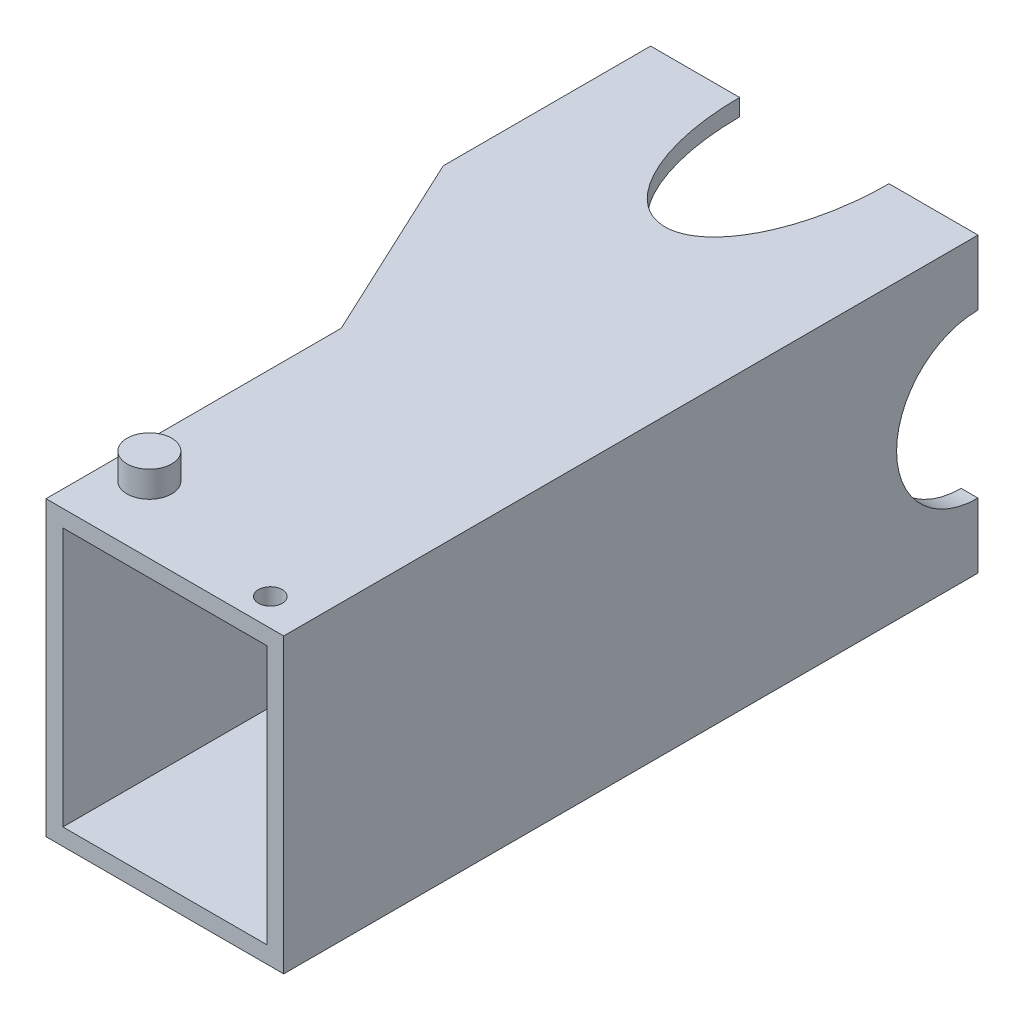
ISO-10303-21;
HEADER;
FILE_DESCRIPTION(('STEP AP214'),'2;1');
FILE_NAME('part.step','',(''),(''),'','','');
FILE_SCHEMA(('AUTOMOTIVE_DESIGN { 1 0 10303 214 1 1 1 1 }'));
ENDSEC;
DATA;
#1=APPLICATION_CONTEXT('core data for automotive mechanical design processes');
#2=APPLICATION_PROTOCOL_DEFINITION('international standard','automotive_design',2000,#1);
#3=PRODUCT_CONTEXT('',#1,'mechanical');
#4=PRODUCT('Part','Part','',(#3));
#5=PRODUCT_RELATED_PRODUCT_CATEGORY('part','',(#4));
#6=PRODUCT_DEFINITION_FORMATION('','',#4);
#7=PRODUCT_DEFINITION_CONTEXT('part definition',#1,'design');
#8=PRODUCT_DEFINITION('design','',#6,#7);
#9=PRODUCT_DEFINITION_SHAPE('','',#8);
#10=(LENGTH_UNIT() NAMED_UNIT(*) SI_UNIT(.MILLI.,.METRE.));
#11=(NAMED_UNIT(*) PLANE_ANGLE_UNIT() SI_UNIT($,.RADIAN.));
#12=(NAMED_UNIT(*) SI_UNIT($,.STERADIAN.) SOLID_ANGLE_UNIT());
#13=UNCERTAINTY_MEASURE_WITH_UNIT(LENGTH_MEASURE(1.E-05),#10,'distance_accuracy_value','');
#14=(GEOMETRIC_REPRESENTATION_CONTEXT(3) GLOBAL_UNCERTAINTY_ASSIGNED_CONTEXT((#13)) GLOBAL_UNIT_ASSIGNED_CONTEXT((#10,
#11,#12)) REPRESENTATION_CONTEXT('',''));
#15=CARTESIAN_POINT('',(0.,0.,0.));
#16=DIRECTION('',(0.,0.,1.));
#17=DIRECTION('',(1.,0.,0.));
#18=AXIS2_PLACEMENT_3D('',#15,#16,#17);
#19=CARTESIAN_POINT('',(0.,0.,0.));
#20=DIRECTION('',(0.,0.,-1.));
#21=DIRECTION('',(-1.,0.,0.));
#22=AXIS2_PLACEMENT_3D('',#19,#20,#21);
#23=PLANE('',#22);
#24=DIRECTION('',(1.,0.,0.));
#25=VECTOR('',#24,1.);
#26=CARTESIAN_POINT('',(-100.,-8.73500000000001,0.));
#27=LINE('',#26,#25);
#28=CARTESIAN_POINT('',(-44.03,-8.735,0.));
#29=VERTEX_POINT('',#28);
#30=CARTESIAN_POINT('',(-41.76,-8.735,0.));
#31=VERTEX_POINT('',#30);
#32=EDGE_CURVE('E48',#29,#31,#27,.T.);
#33=ORIENTED_EDGE('',*,*,#32,.F.);
#34=DIRECTION('',(0.,-1.,0.));
#35=VECTOR('',#34,1.);
#36=CARTESIAN_POINT('',(-44.03,0.,0.));
#37=LINE('',#36,#35);
#38=CARTESIAN_POINT('',(-44.03,0.,0.));
#39=VERTEX_POINT('',#38);
#40=EDGE_CURVE('E234',#39,#29,#37,.T.);
#41=ORIENTED_EDGE('',*,*,#40,.F.);
#42=DIRECTION('',(-1.,0.,0.));
#43=VECTOR('',#42,1.);
#44=CARTESIAN_POINT('',(0.,0.,0.));
#45=LINE('',#44,#43);
#46=CARTESIAN_POINT('',(-32.065,0.,0.));
#47=VERTEX_POINT('',#46);
#48=EDGE_CURVE('E224',#47,#39,#45,.T.);
#49=ORIENTED_EDGE('',*,*,#48,.F.);
#50=DIRECTION('',(0.,1.,0.));
#51=VECTOR('',#50,1.);
#52=CARTESIAN_POINT('',(-32.065,-100.,0.));
#53=LINE('',#52,#51);
#54=CARTESIAN_POINT('',(-32.065,-2.27,0.));
#55=VERTEX_POINT('',#54);
#56=EDGE_CURVE('E473',#55,#47,#53,.T.);
#57=ORIENTED_EDGE('',*,*,#56,.F.);
#58=DIRECTION('',(1.,0.,0.));
#59=VECTOR('',#58,1.);
#60=CARTESIAN_POINT('',(-41.76,-2.27,0.));
#61=LINE('',#60,#59);
#62=CARTESIAN_POINT('',(-41.76,-2.27,0.));
#63=VERTEX_POINT('',#62);
#64=EDGE_CURVE('E284',#63,#55,#61,.T.);
#65=ORIENTED_EDGE('',*,*,#64,.F.);
#66=DIRECTION('',(0.,1.,0.));
#67=VECTOR('',#66,1.);
#68=CARTESIAN_POINT('',(-41.76,-37.1,0.));
#69=LINE('',#68,#67);
#70=EDGE_CURVE('E293',#31,#63,#69,.T.);
#71=ORIENTED_EDGE('',*,*,#70,.F.);
#72=EDGE_LOOP('',(#33,#41,#49,#57,#65,#71));
#73=FACE_BOUND('',#72,.T.);
#74=ADVANCED_FACE('F33',(#73),#23,.T.);
#75=DIRECTION('',(1.,0.,0.));
#76=VECTOR('',#75,1.);
#77=CARTESIAN_POINT('',(-100.,-8.73500000000001,0.));
#78=LINE('',#77,#76);
#79=CARTESIAN_POINT('',(-2.26999999999999,-8.735,0.));
#80=VERTEX_POINT('',#79);
#81=CARTESIAN_POINT('',(0.,-8.735,0.));
#82=VERTEX_POINT('',#81);
#83=EDGE_CURVE('E197',#80,#82,#78,.T.);
#84=ORIENTED_EDGE('',*,*,#83,.F.);
#85=DIRECTION('',(0.,-1.,0.));
#86=VECTOR('',#85,1.);
#87=CARTESIAN_POINT('',(-2.26999999999999,-37.1,0.));
#88=LINE('',#87,#86);
#89=CARTESIAN_POINT('',(-2.26999999999999,-2.27,0.));
#90=VERTEX_POINT('',#89);
#91=EDGE_CURVE('E288',#90,#80,#88,.T.);
#92=ORIENTED_EDGE('',*,*,#91,.F.);
#93=CARTESIAN_POINT('',(-11.965,-2.27,0.));
#94=VERTEX_POINT('',#93);
#95=EDGE_CURVE('E280',#94,#90,#61,.T.);
#96=ORIENTED_EDGE('',*,*,#95,.F.);
#97=DIRECTION('',(0.,1.,0.));
#98=VECTOR('',#97,1.);
#99=CARTESIAN_POINT('',(-11.965,-100.,0.));
#100=LINE('',#99,#98);
#101=CARTESIAN_POINT('',(-11.965,0.,0.));
#102=VERTEX_POINT('',#101);
#103=EDGE_CURVE('E287',#102,#94,#100,.F.);
#104=ORIENTED_EDGE('',*,*,#103,.F.);
#105=CARTESIAN_POINT('',(0.,0.,0.));
#106=VERTEX_POINT('',#105);
#107=EDGE_CURVE('E220',#106,#102,#45,.T.);
#108=ORIENTED_EDGE('',*,*,#107,.F.);
#109=DIRECTION('',(0.,1.,0.));
#110=VECTOR('',#109,1.);
#111=CARTESIAN_POINT('',(0.,0.,0.));
#112=LINE('',#111,#110);
#113=EDGE_CURVE('E211',#82,#106,#112,.T.);
#114=ORIENTED_EDGE('',*,*,#113,.F.);
#115=EDGE_LOOP('',(#84,#92,#96,#104,#108,#114));
#116=FACE_BOUND('',#115,.T.);
#117=ADVANCED_FACE('F217',(#116),#23,.T.);
#118=DIRECTION('',(1.,0.,0.));
#119=VECTOR('',#118,1.);
#120=CARTESIAN_POINT('',(-100.,-30.635,0.));
#121=LINE('',#120,#119);
#122=CARTESIAN_POINT('',(-41.76,-30.635,0.));
#123=VERTEX_POINT('',#122);
#124=CARTESIAN_POINT('',(-44.03,-30.635,0.));
#125=VERTEX_POINT('',#124);
#126=EDGE_CURVE('E361',#123,#125,#121,.F.);
#127=ORIENTED_EDGE('',*,*,#126,.F.);
#128=CARTESIAN_POINT('',(-41.76,-37.1,0.));
#129=VERTEX_POINT('',#128);
#130=EDGE_CURVE('E289',#129,#123,#69,.T.);
#131=ORIENTED_EDGE('',*,*,#130,.F.);
#132=DIRECTION('',(-1.,0.,0.));
#133=VECTOR('',#132,1.);
#134=CARTESIAN_POINT('',(-41.76,-37.1,0.));
#135=LINE('',#134,#133);
#136=CARTESIAN_POINT('',(-32.065,-37.1,0.));
#137=VERTEX_POINT('',#136);
#138=EDGE_CURVE('E298',#137,#129,#135,.T.);
#139=ORIENTED_EDGE('',*,*,#138,.F.);
#140=CARTESIAN_POINT('',(-32.065,-39.37,0.));
#141=VERTEX_POINT('',#140);
#142=EDGE_CURVE('E364',#141,#137,#53,.T.);
#143=ORIENTED_EDGE('',*,*,#142,.F.);
#144=DIRECTION('',(1.,0.,0.));
#145=VECTOR('',#144,1.);
#146=CARTESIAN_POINT('',(0.,-39.37,0.));
#147=LINE('',#146,#145);
#148=CARTESIAN_POINT('',(-44.03,-39.37,0.));
#149=VERTEX_POINT('',#148);
#150=EDGE_CURVE('E238',#149,#141,#147,.T.);
#151=ORIENTED_EDGE('',*,*,#150,.F.);
#152=EDGE_CURVE('E233',#125,#149,#37,.T.);
#153=ORIENTED_EDGE('',*,*,#152,.F.);
#154=EDGE_LOOP('',(#127,#131,#139,#143,#151,#153));
#155=FACE_BOUND('',#154,.T.);
#156=ADVANCED_FACE('F359',(#155),#23,.T.);
#157=CARTESIAN_POINT('',(-41.76,-37.1,27.4));
#158=DIRECTION('',(-1.,0.,0.));
#159=DIRECTION('',(0.,0.,1.));
#160=AXIS2_PLACEMENT_3D('',#157,#158,#159);
#161=PLANE('',#160);
#162=DIRECTION('',(0.,-1.,0.));
#163=VECTOR('',#162,1.);
#164=CARTESIAN_POINT('',(-41.76,-37.1,27.3952896919257));
#165=LINE('',#164,#163);
#166=CARTESIAN_POINT('',(-41.76,-2.27,27.3952896919257));
#167=VERTEX_POINT('',#166);
#168=CARTESIAN_POINT('',(-41.76,-37.1,27.3952896919257));
#169=VERTEX_POINT('',#168);
#170=EDGE_CURVE('E496',#167,#169,#165,.T.);
#171=ORIENTED_EDGE('',*,*,#170,.F.);
#172=DIRECTION('',(0.,0.,-1.));
#173=VECTOR('',#172,1.);
#174=CARTESIAN_POINT('',(-41.76,-2.27,27.4));
#175=LINE('',#174,#173);
#176=CARTESIAN_POINT('',(-41.76,-2.27,27.4));
#177=VERTEX_POINT('',#176);
#178=EDGE_CURVE('E313',#177,#167,#175,.T.);
#179=ORIENTED_EDGE('',*,*,#178,.F.);
#180=DIRECTION('',(0.,1.,0.));
#181=VECTOR('',#180,1.);
#182=CARTESIAN_POINT('',(-41.76,-37.1,27.4));
#183=LINE('',#182,#181);
#184=CARTESIAN_POINT('',(-41.76,-37.1,27.4));
#185=VERTEX_POINT('',#184);
#186=EDGE_CURVE('E302',#185,#177,#183,.T.);
#187=ORIENTED_EDGE('',*,*,#186,.F.);
#188=DIRECTION('',(0.,0.,-1.));
#189=VECTOR('',#188,1.);
#190=CARTESIAN_POINT('',(-41.76,-37.1,27.4));
#191=LINE('',#190,#189);
#192=EDGE_CURVE('E303',#185,#169,#191,.T.);
#193=ORIENTED_EDGE('',*,*,#192,.T.);
#194=EDGE_LOOP('',(#171,#179,#187,#193));
#195=FACE_BOUND('',#194,.T.);
#196=ADVANCED_FACE('F426',(#195),#161,.F.);
#197=CARTESIAN_POINT('',(0.,0.,27.4));
#198=DIRECTION('',(0.,0.,-1.));
#199=DIRECTION('',(-1.,0.,0.));
#200=AXIS2_PLACEMENT_3D('',#197,#198,#199);
#201=PLANE('',#200);
#202=DIRECTION('',(1.,0.,0.));
#203=VECTOR('',#202,1.);
#204=CARTESIAN_POINT('',(-41.76,-2.27,27.4));
#205=LINE('',#204,#203);
#206=CARTESIAN_POINT('',(-41.7577964966883,-2.27,27.4));
#207=VERTEX_POINT('',#206);
#208=EDGE_CURVE('E534',#177,#207,#205,.T.);
#209=ORIENTED_EDGE('',*,*,#208,.T.);
#210=DIRECTION('',(0.,-1.,0.));
#211=VECTOR('',#210,1.);
#212=CARTESIAN_POINT('',(-41.7577964966883,0.,27.4));
#213=LINE('',#212,#211);
#214=CARTESIAN_POINT('',(-41.7577964966883,-37.1,27.4));
#215=VERTEX_POINT('',#214);
#216=EDGE_CURVE('E255',#207,#215,#213,.T.);
#217=ORIENTED_EDGE('',*,*,#216,.T.);
#218=DIRECTION('',(-1.,0.,0.));
#219=VECTOR('',#218,1.);
#220=CARTESIAN_POINT('',(-41.76,-37.1,27.4));
#221=LINE('',#220,#219);
#222=EDGE_CURVE('E536',#215,#185,#221,.T.);
#223=ORIENTED_EDGE('',*,*,#222,.T.);
#224=ORIENTED_EDGE('',*,*,#186,.T.);
#225=EDGE_LOOP('',(#209,#217,#223,#224));
#226=FACE_BOUND('',#225,.T.);
#227=ADVANCED_FACE('F423',(#226),#201,.T.);
#228=CARTESIAN_POINT('',(0.,0.,93.38));
#229=DIRECTION('',(-1.,0.,0.));
#230=DIRECTION('',(0.,-1.,0.));
#231=AXIS2_PLACEMENT_3D('',#228,#229,#230);
#232=PLANE('',#231);
#233=CARTESIAN_POINT('',(0.,-39.37,0.));
#234=VERTEX_POINT('',#233);
#235=CARTESIAN_POINT('',(0.,-30.635,0.));
#236=VERTEX_POINT('',#235);
#237=EDGE_CURVE('E215',#234,#236,#112,.T.);
#238=ORIENTED_EDGE('',*,*,#237,.T.);
#239=CARTESIAN_POINT('',(0.,-19.685,0.));
#240=DIRECTION('',(1.,0.,0.));
#241=DIRECTION('',(0.,1.,0.));
#242=AXIS2_PLACEMENT_3D('',#239,#240,#241);
#243=CIRCLE('',#242,10.95);
#244=EDGE_CURVE('E200',#82,#236,#243,.T.);
#245=ORIENTED_EDGE('',*,*,#244,.F.);
#246=ORIENTED_EDGE('',*,*,#113,.T.);
#247=DIRECTION('',(0.,0.,-1.));
#248=VECTOR('',#247,1.);
#249=CARTESIAN_POINT('',(0.,0.,93.38));
#250=LINE('',#249,#248);
#251=CARTESIAN_POINT('',(0.,0.,93.38));
#252=VERTEX_POINT('',#251);
#253=EDGE_CURVE('E250',#252,#106,#250,.T.);
#254=ORIENTED_EDGE('',*,*,#253,.F.);
#255=DIRECTION('',(0.,1.,0.));
#256=VECTOR('',#255,1.);
#257=CARTESIAN_POINT('',(0.,0.,93.38));
#258=LINE('',#257,#256);
#259=CARTESIAN_POINT('',(0.,-39.37,93.38));
#260=VERTEX_POINT('',#259);
#261=EDGE_CURVE('E241',#260,#252,#258,.T.);
#262=ORIENTED_EDGE('',*,*,#261,.F.);
#263=DIRECTION('',(0.,0.,-1.));
#264=VECTOR('',#263,1.);
#265=CARTESIAN_POINT('',(0.,-39.37,93.38));
#266=LINE('',#265,#264);
#267=EDGE_CURVE('E242',#260,#234,#266,.T.);
#268=ORIENTED_EDGE('',*,*,#267,.T.);
#269=EDGE_LOOP('',(#238,#245,#246,#254,#262,#268));
#270=FACE_BOUND('',#269,.T.);
#271=ADVANCED_FACE('F209',(#270),#232,.F.);
#272=CARTESIAN_POINT('',(0.,0.,93.38));
#273=DIRECTION('',(0.,-1.,0.));
#274=DIRECTION('',(1.,0.,0.));
#275=AXIS2_PLACEMENT_3D('',#272,#273,#274);
#276=PLANE('',#275);
#277=CARTESIAN_POINT('',(-5.5,0.,89.68));
#278=DIRECTION('',(0.,1.,0.));
#279=DIRECTION('',(-1.,0.,0.));
#280=AXIS2_PLACEMENT_3D('',#277,#278,#279);
#281=CIRCLE('',#280,1.6);
#282=CARTESIAN_POINT('',(-7.1,0.,89.68));
#283=VERTEX_POINT('',#282);
#284=EDGE_CURVE('E274',#283,#283,#281,.T.);
#285=ORIENTED_EDGE('',*,*,#284,.F.);
#286=EDGE_LOOP('',(#285));
#287=FACE_BOUND('',#286,.T.);
#288=CARTESIAN_POINT('',(-27.07,0.,84.38));
#289=DIRECTION('',(0.,-1.,0.));
#290=DIRECTION('',(1.,0.,0.));
#291=AXIS2_PLACEMENT_3D('',#288,#289,#290);
#292=CIRCLE('',#291,3.);
#293=CARTESIAN_POINT('',(-24.07,0.,84.38));
#294=VERTEX_POINT('',#293);
#295=EDGE_CURVE('E268',#294,#294,#292,.F.);
#296=ORIENTED_EDGE('',*,*,#295,.F.);
#297=EDGE_LOOP('',(#296));
#298=FACE_BOUND('',#297,.T.);
#299=ORIENTED_EDGE('',*,*,#107,.T.);
#300=CARTESIAN_POINT('',(-22.015,0.,0.));
#301=DIRECTION('',(0.,1.,0.));
#302=DIRECTION('',(0.,0.,-1.));
#303=AXIS2_PLACEMENT_3D('',#300,#301,#302);
#304=ELLIPSE('',#303,20.1,10.05);
#305=EDGE_CURVE('E380',#47,#102,#304,.T.);
#306=ORIENTED_EDGE('',*,*,#305,.F.);
#307=ORIENTED_EDGE('',*,*,#48,.T.);
#308=DIRECTION('',(0.,0.,-1.));
#309=VECTOR('',#308,1.);
#310=CARTESIAN_POINT('',(-44.03,0.,93.38));
#311=LINE('',#310,#309);
#312=CARTESIAN_POINT('',(-44.03,0.,27.9));
#313=VERTEX_POINT('',#312);
#314=EDGE_CURVE('E247',#313,#39,#311,.T.);
#315=ORIENTED_EDGE('',*,*,#314,.F.);
#316=DIRECTION('',(-0.423731605419439,0.,-0.905787793342715));
#317=VECTOR('',#316,1.);
#318=CARTESIAN_POINT('',(-44.03,0.,27.9));
#319=LINE('',#318,#317);
#320=CARTESIAN_POINT('',(-31.97,0.,53.68));
#321=VERTEX_POINT('',#320);
#322=EDGE_CURVE('E306',#321,#313,#319,.T.);
#323=ORIENTED_EDGE('',*,*,#322,.F.);
#324=DIRECTION('',(0.,0.,-1.));
#325=VECTOR('',#324,1.);
#326=CARTESIAN_POINT('',(-31.97,0.,93.38));
#327=LINE('',#326,#325);
#328=CARTESIAN_POINT('',(-31.97,0.,93.38));
#329=VERTEX_POINT('',#328);
#330=EDGE_CURVE('E324',#329,#321,#327,.T.);
#331=ORIENTED_EDGE('',*,*,#330,.F.);
#332=DIRECTION('',(-1.,0.,0.));
#333=VECTOR('',#332,1.);
#334=CARTESIAN_POINT('',(0.,0.,93.38));
#335=LINE('',#334,#333);
#336=EDGE_CURVE('E329',#252,#329,#335,.T.);
#337=ORIENTED_EDGE('',*,*,#336,.F.);
#338=ORIENTED_EDGE('',*,*,#253,.T.);
#339=EDGE_LOOP('',(#299,#306,#307,#315,#323,#331,#337,#338));
#340=FACE_BOUND('',#339,.T.);
#341=ADVANCED_FACE('F341',(#287,#298,#340),#276,.F.);
#342=CARTESIAN_POINT('',(-44.03,0.,93.38));
#343=DIRECTION('',(1.,0.,0.));
#344=DIRECTION('',(0.,1.,0.));
#345=AXIS2_PLACEMENT_3D('',#342,#343,#344);
#346=PLANE('',#345);
#347=ORIENTED_EDGE('',*,*,#40,.T.);
#348=CARTESIAN_POINT('',(-44.03,-19.685,0.));
#349=DIRECTION('',(1.,0.,0.));
#350=DIRECTION('',(0.,1.,0.));
#351=AXIS2_PLACEMENT_3D('',#348,#349,#350);
#352=CIRCLE('',#351,10.95);
#353=EDGE_CURVE('E356',#29,#125,#352,.T.);
#354=ORIENTED_EDGE('',*,*,#353,.T.);
#355=ORIENTED_EDGE('',*,*,#152,.T.);
#356=DIRECTION('',(0.,0.,-1.));
#357=VECTOR('',#356,1.);
#358=CARTESIAN_POINT('',(-44.03,-39.37,93.38));
#359=LINE('',#358,#357);
#360=CARTESIAN_POINT('',(-44.03,-39.37,27.9));
#361=VERTEX_POINT('',#360);
#362=EDGE_CURVE('E244',#361,#149,#359,.T.);
#363=ORIENTED_EDGE('',*,*,#362,.F.);
#364=DIRECTION('',(0.,1.,0.));
#365=VECTOR('',#364,1.);
#366=CARTESIAN_POINT('',(-44.03,-93.38,27.9));
#367=LINE('',#366,#365);
#368=EDGE_CURVE('E318',#361,#313,#367,.T.);
#369=ORIENTED_EDGE('',*,*,#368,.T.);
#370=ORIENTED_EDGE('',*,*,#314,.T.);
#371=EDGE_LOOP('',(#347,#354,#355,#363,#369,#370));
#372=FACE_BOUND('',#371,.T.);
#373=ADVANCED_FACE('F353',(#372),#346,.F.);
#374=CARTESIAN_POINT('',(0.,-39.37,93.38));
#375=DIRECTION('',(0.,1.,0.));
#376=DIRECTION('',(-1.,0.,0.));
#377=AXIS2_PLACEMENT_3D('',#374,#375,#376);
#378=PLANE('',#377);
#379=CARTESIAN_POINT('',(-27.07,-39.37,84.38));
#380=DIRECTION('',(0.,1.,0.));
#381=DIRECTION('',(-1.,0.,0.));
#382=AXIS2_PLACEMENT_3D('',#379,#380,#381);
#383=CIRCLE('',#382,3.);
#384=CARTESIAN_POINT('',(-30.07,-39.37,84.38));
#385=VERTEX_POINT('',#384);
#386=EDGE_CURVE('E265',#385,#385,#383,.F.);
#387=ORIENTED_EDGE('',*,*,#386,.F.);
#388=EDGE_LOOP('',(#387));
#389=FACE_BOUND('',#388,.T.);
#390=ORIENTED_EDGE('',*,*,#150,.T.);
#391=CARTESIAN_POINT('',(-22.015,-39.37,0.));
#392=DIRECTION('',(0.,1.,0.));
#393=DIRECTION('',(0.,0.,-1.));
#394=AXIS2_PLACEMENT_3D('',#391,#392,#393);
#395=ELLIPSE('',#394,20.1,10.05);
#396=CARTESIAN_POINT('',(-11.965,-39.37,0.));
#397=VERTEX_POINT('',#396);
#398=EDGE_CURVE('E365',#141,#397,#395,.T.);
#399=ORIENTED_EDGE('',*,*,#398,.T.);
#400=EDGE_CURVE('E237',#397,#234,#147,.T.);
#401=ORIENTED_EDGE('',*,*,#400,.T.);
#402=ORIENTED_EDGE('',*,*,#267,.F.);
#403=DIRECTION('',(1.,0.,0.));
#404=VECTOR('',#403,1.);
#405=CARTESIAN_POINT('',(0.,-39.37,93.38));
#406=LINE('',#405,#404);
#407=CARTESIAN_POINT('',(-31.97,-39.37,93.38));
#408=VERTEX_POINT('',#407);
#409=EDGE_CURVE('E230',#408,#260,#406,.T.);
#410=ORIENTED_EDGE('',*,*,#409,.F.);
#411=DIRECTION('',(0.,0.,-1.));
#412=VECTOR('',#411,1.);
#413=CARTESIAN_POINT('',(-31.97,-39.37,93.38));
#414=LINE('',#413,#412);
#415=CARTESIAN_POINT('',(-31.97,-39.37,53.68));
#416=VERTEX_POINT('',#415);
#417=EDGE_CURVE('E222',#408,#416,#414,.T.);
#418=ORIENTED_EDGE('',*,*,#417,.T.);
#419=DIRECTION('',(-0.423731605419439,0.,-0.905787793342715));
#420=VECTOR('',#419,1.);
#421=CARTESIAN_POINT('',(-10.9925419454553,-39.37,98.5223605842588));
#422=LINE('',#421,#420);
#423=EDGE_CURVE('E321',#416,#361,#422,.T.);
#424=ORIENTED_EDGE('',*,*,#423,.T.);
#425=ORIENTED_EDGE('',*,*,#362,.T.);
#426=EDGE_LOOP('',(#390,#399,#401,#402,#410,#418,#424,#425));
#427=FACE_BOUND('',#426,.T.);
#428=ADVANCED_FACE('F337',(#389,#427),#378,.F.);
#429=CARTESIAN_POINT('',(0.,0.,93.38));
#430=DIRECTION('',(0.,0.,-1.));
#431=DIRECTION('',(-1.,0.,0.));
#432=AXIS2_PLACEMENT_3D('',#429,#430,#431);
#433=PLANE('',#432);
#434=DIRECTION('',(1.,0.,0.));
#435=VECTOR('',#434,1.);
#436=CARTESIAN_POINT('',(-29.7,-37.1,93.38));
#437=LINE('',#436,#435);
#438=CARTESIAN_POINT('',(-29.7,-37.1,93.38));
#439=VERTEX_POINT('',#438);
#440=CARTESIAN_POINT('',(-2.26999999999999,-37.1,93.38));
#441=VERTEX_POINT('',#440);
#442=EDGE_CURVE('E519',#439,#441,#437,.T.);
#443=ORIENTED_EDGE('',*,*,#442,.F.);
#444=DIRECTION('',(0.,-1.,0.));
#445=VECTOR('',#444,1.);
#446=CARTESIAN_POINT('',(-29.7,-37.1,93.38));
#447=LINE('',#446,#445);
#448=CARTESIAN_POINT('',(-29.7,-2.27,93.38));
#449=VERTEX_POINT('',#448);
#450=EDGE_CURVE('E516',#449,#439,#447,.T.);
#451=ORIENTED_EDGE('',*,*,#450,.F.);
#452=DIRECTION('',(-1.,0.,0.));
#453=VECTOR('',#452,1.);
#454=CARTESIAN_POINT('',(-29.7,-2.27,93.38));
#455=LINE('',#454,#453);
#456=CARTESIAN_POINT('',(-2.26999999999999,-2.27,93.38));
#457=VERTEX_POINT('',#456);
#458=EDGE_CURVE('E525',#457,#449,#455,.T.);
#459=ORIENTED_EDGE('',*,*,#458,.F.);
#460=DIRECTION('',(0.,1.,0.));
#461=VECTOR('',#460,1.);
#462=CARTESIAN_POINT('',(-2.26999999999999,-37.1,93.38));
#463=LINE('',#462,#461);
#464=EDGE_CURVE('E522',#441,#457,#463,.T.);
#465=ORIENTED_EDGE('',*,*,#464,.F.);
#466=EDGE_LOOP('',(#443,#451,#459,#465));
#467=FACE_BOUND('',#466,.T.);
#468=ORIENTED_EDGE('',*,*,#336,.T.);
#469=DIRECTION('',(0.,-1.,0.));
#470=VECTOR('',#469,1.);
#471=CARTESIAN_POINT('',(-31.97,0.,93.38));
#472=LINE('',#471,#470);
#473=EDGE_CURVE('E252',#329,#408,#472,.T.);
#474=ORIENTED_EDGE('',*,*,#473,.T.);
#475=ORIENTED_EDGE('',*,*,#409,.T.);
#476=ORIENTED_EDGE('',*,*,#261,.T.);
#477=EDGE_LOOP('',(#468,#474,#475,#476));
#478=FACE_BOUND('',#477,.T.);
#479=ADVANCED_FACE('F334',(#467,#478),#433,.F.);
#480=DIRECTION('',(1.,0.,0.));
#481=VECTOR('',#480,1.);
#482=CARTESIAN_POINT('',(-100.,-30.635,0.));
#483=LINE('',#482,#481);
#484=CARTESIAN_POINT('',(-2.26999999999999,-30.635,0.));
#485=VERTEX_POINT('',#484);
#486=EDGE_CURVE('E56',#236,#485,#483,.F.);
#487=ORIENTED_EDGE('',*,*,#486,.F.);
#488=ORIENTED_EDGE('',*,*,#237,.F.);
#489=ORIENTED_EDGE('',*,*,#400,.F.);
#490=CARTESIAN_POINT('',(-11.965,-37.1,0.));
#491=VERTEX_POINT('',#490);
#492=EDGE_CURVE('E372',#491,#397,#100,.F.);
#493=ORIENTED_EDGE('',*,*,#492,.F.);
#494=CARTESIAN_POINT('',(-2.26999999999999,-37.1,0.));
#495=VERTEX_POINT('',#494);
#496=EDGE_CURVE('E299',#495,#491,#135,.T.);
#497=ORIENTED_EDGE('',*,*,#496,.F.);
#498=EDGE_CURVE('E291',#485,#495,#88,.T.);
#499=ORIENTED_EDGE('',*,*,#498,.F.);
#500=EDGE_LOOP('',(#487,#488,#489,#493,#497,#499));
#501=FACE_BOUND('',#500,.T.);
#502=ADVANCED_FACE('F370',(#501),#23,.T.);
#503=CARTESIAN_POINT('',(-31.97,-93.38,93.38));
#504=DIRECTION('',(1.,0.,0.));
#505=DIRECTION('',(0.,1.,0.));
#506=AXIS2_PLACEMENT_3D('',#503,#504,#505);
#507=PLANE('',#506);
#508=ORIENTED_EDGE('',*,*,#473,.F.);
#509=ORIENTED_EDGE('',*,*,#330,.T.);
#510=DIRECTION('',(0.,1.,0.));
#511=VECTOR('',#510,1.);
#512=CARTESIAN_POINT('',(-31.97,-93.38,53.68));
#513=LINE('',#512,#511);
#514=EDGE_CURVE('E226',#416,#321,#513,.T.);
#515=ORIENTED_EDGE('',*,*,#514,.F.);
#516=ORIENTED_EDGE('',*,*,#417,.F.);
#517=EDGE_LOOP('',(#508,#509,#515,#516));
#518=FACE_BOUND('',#517,.T.);
#519=ADVANCED_FACE('F348',(#518),#507,.F.);
#520=CARTESIAN_POINT('',(-44.03,-93.38,27.9));
#521=DIRECTION('',(0.905787793342715,0.,-0.423731605419439));
#522=DIRECTION('',(-0.423731605419439,0.,-0.905787793342715));
#523=AXIS2_PLACEMENT_3D('',#520,#521,#522);
#524=PLANE('',#523);
#525=ORIENTED_EDGE('',*,*,#514,.T.);
#526=ORIENTED_EDGE('',*,*,#322,.T.);
#527=ORIENTED_EDGE('',*,*,#368,.F.);
#528=ORIENTED_EDGE('',*,*,#423,.F.);
#529=EDGE_LOOP('',(#525,#526,#527,#528));
#530=FACE_BOUND('',#529,.T.);
#531=ADVANCED_FACE('F442',(#530),#524,.F.);
#532=ORIENTED_EDGE('',*,*,#130,.T.);
#533=CARTESIAN_POINT('',(-41.76,-19.685,0.));
#534=DIRECTION('',(-1.,0.,0.));
#535=DIRECTION('',(0.,0.,1.));
#536=AXIS2_PLACEMENT_3D('',#533,#534,#535);
#537=CIRCLE('',#536,10.95);
#538=EDGE_CURVE('E205',#123,#31,#537,.T.);
#539=ORIENTED_EDGE('',*,*,#538,.T.);
#540=ORIENTED_EDGE('',*,*,#70,.T.);
#541=CARTESIAN_POINT('',(-41.76,-2.27,26.8380837858805));
#542=VERTEX_POINT('',#541);
#543=EDGE_CURVE('E316',#542,#63,#175,.T.);
#544=ORIENTED_EDGE('',*,*,#543,.F.);
#545=DIRECTION('',(0.,-1.,0.));
#546=VECTOR('',#545,1.);
#547=CARTESIAN_POINT('',(-41.76,-37.1,26.8380837858805));
#548=LINE('',#547,#546);
#549=CARTESIAN_POINT('',(-41.76,-37.1,26.8380837858805));
#550=VERTEX_POINT('',#549);
#551=EDGE_CURVE('E482',#542,#550,#548,.T.);
#552=ORIENTED_EDGE('',*,*,#551,.T.);
#553=EDGE_CURVE('E307',#550,#129,#191,.T.);
#554=ORIENTED_EDGE('',*,*,#553,.T.);
#555=EDGE_LOOP('',(#532,#539,#540,#544,#552,#554));
#556=FACE_BOUND('',#555,.T.);
#557=ADVANCED_FACE('F432',(#556),#161,.F.);
#558=CARTESIAN_POINT('',(-41.76,-37.1,27.4));
#559=DIRECTION('',(0.,-1.,0.));
#560=DIRECTION('',(1.,0.,0.));
#561=AXIS2_PLACEMENT_3D('',#558,#559,#560);
#562=PLANE('',#561);
#563=ORIENTED_EDGE('',*,*,#496,.T.);
#564=CARTESIAN_POINT('',(-22.015,-37.1,0.));
#565=DIRECTION('',(0.,1.,0.));
#566=DIRECTION('',(0.,0.,-1.));
#567=AXIS2_PLACEMENT_3D('',#564,#565,#566);
#568=ELLIPSE('',#567,20.1,10.05);
#569=EDGE_CURVE('E474',#491,#137,#568,.F.);
#570=ORIENTED_EDGE('',*,*,#569,.T.);
#571=ORIENTED_EDGE('',*,*,#138,.T.);
#572=ORIENTED_EDGE('',*,*,#553,.F.);
#573=DIRECTION('',(-0.905787793342715,0.,0.423731605419439));
#574=VECTOR('',#573,1.);
#575=CARTESIAN_POINT('',(-23.8581058422577,-37.1,18.4634971473091));
#576=LINE('',#575,#574);
#577=CARTESIAN_POINT('',(-41.973861709112,-37.1,26.9381292556979));
#578=VERTEX_POINT('',#577);
#579=EDGE_CURVE('E484',#550,#578,#576,.T.);
#580=ORIENTED_EDGE('',*,*,#579,.T.);
#581=DIRECTION('',(0.423731605419439,0.,0.905787793342715));
#582=VECTOR('',#581,1.);
#583=CARTESIAN_POINT('',(-41.973861709112,-37.1,26.9381292556979));
#584=LINE('',#583,#582);
#585=EDGE_CURVE('E487',#578,#169,#584,.T.);
#586=ORIENTED_EDGE('',*,*,#585,.T.);
#587=ORIENTED_EDGE('',*,*,#192,.F.);
#588=ORIENTED_EDGE('',*,*,#222,.F.);
#589=CARTESIAN_POINT('',(-29.913861709112,-37.1,52.7181292556979));
#590=VERTEX_POINT('',#589);
#591=EDGE_CURVE('E498',#215,#590,#584,.T.);
#592=ORIENTED_EDGE('',*,*,#591,.T.);
#593=CARTESIAN_POINT('',(-39.7,-37.1,54.7751896222443));
#594=DIRECTION('',(0.,-1.,0.));
#595=DIRECTION('',(1.,0.,0.));
#596=AXIS2_PLACEMENT_3D('',#593,#594,#595);
#597=CIRCLE('',#596,10.);
#598=CARTESIAN_POINT('',(-29.7,-37.1,54.7751896222443));
#599=VERTEX_POINT('',#598);
#600=EDGE_CURVE('E263',#590,#599,#597,.T.);
#601=ORIENTED_EDGE('',*,*,#600,.T.);
#602=DIRECTION('',(0.,0.,1.));
#603=VECTOR('',#602,1.);
#604=CARTESIAN_POINT('',(-29.7,-37.1,-6.62000000000002));
#605=LINE('',#604,#603);
#606=EDGE_CURVE('E528',#599,#439,#605,.T.);
#607=ORIENTED_EDGE('',*,*,#606,.T.);
#608=ORIENTED_EDGE('',*,*,#442,.T.);
#609=DIRECTION('',(0.,0.,-1.));
#610=VECTOR('',#609,1.);
#611=CARTESIAN_POINT('',(-2.26999999999999,-37.1,27.4));
#612=LINE('',#611,#610);
#613=EDGE_CURVE('E308',#441,#495,#612,.T.);
#614=ORIENTED_EDGE('',*,*,#613,.T.);
#615=EDGE_LOOP('',(#563,#570,#571,#572,#580,#586,#587,#588,#592,#601,#607,#608,#614));
#616=FACE_BOUND('',#615,.T.);
#617=ADVANCED_FACE('F428',(#616),#562,.F.);
#618=CARTESIAN_POINT('',(-2.26999999999999,-37.1,27.4));
#619=DIRECTION('',(1.,0.,0.));
#620=DIRECTION('',(0.,0.,-1.));
#621=AXIS2_PLACEMENT_3D('',#618,#619,#620);
#622=PLANE('',#621);
#623=ORIENTED_EDGE('',*,*,#91,.T.);
#624=CARTESIAN_POINT('',(-2.26999999999999,-19.685,0.));
#625=DIRECTION('',(1.,0.,0.));
#626=DIRECTION('',(0.,0.,-1.));
#627=AXIS2_PLACEMENT_3D('',#624,#625,#626);
#628=CIRCLE('',#627,10.95);
#629=EDGE_CURVE('E11',#80,#485,#628,.T.);
#630=ORIENTED_EDGE('',*,*,#629,.T.);
#631=ORIENTED_EDGE('',*,*,#498,.T.);
#632=ORIENTED_EDGE('',*,*,#613,.F.);
#633=ORIENTED_EDGE('',*,*,#464,.T.);
#634=DIRECTION('',(0.,0.,-1.));
#635=VECTOR('',#634,1.);
#636=CARTESIAN_POINT('',(-2.26999999999999,-2.27,27.4));
#637=LINE('',#636,#635);
#638=EDGE_CURVE('E311',#457,#90,#637,.T.);
#639=ORIENTED_EDGE('',*,*,#638,.T.);
#640=EDGE_LOOP('',(#623,#630,#631,#632,#633,#639));
#641=FACE_BOUND('',#640,.T.);
#642=ADVANCED_FACE('F431',(#641),#622,.F.);
#643=CARTESIAN_POINT('',(-41.76,-2.27,27.4));
#644=DIRECTION('',(0.,1.,0.));
#645=DIRECTION('',(-1.,0.,0.));
#646=AXIS2_PLACEMENT_3D('',#643,#644,#645);
#647=PLANE('',#646);
#648=CARTESIAN_POINT('',(-5.5,-2.27,89.68));
#649=DIRECTION('',(0.,1.,0.));
#650=DIRECTION('',(-1.,0.,0.));
#651=AXIS2_PLACEMENT_3D('',#648,#649,#650);
#652=CIRCLE('',#651,1.6);
#653=CARTESIAN_POINT('',(-7.1,-2.27,89.68));
#654=VERTEX_POINT('',#653);
#655=EDGE_CURVE('E271',#654,#654,#652,.T.);
#656=ORIENTED_EDGE('',*,*,#655,.T.);
#657=EDGE_LOOP('',(#656));
#658=FACE_BOUND('',#657,.T.);
#659=ORIENTED_EDGE('',*,*,#64,.T.);
#660=CARTESIAN_POINT('',(-22.015,-2.26999999999999,0.));
#661=DIRECTION('',(0.,1.,0.));
#662=DIRECTION('',(0.,0.,-1.));
#663=AXIS2_PLACEMENT_3D('',#660,#661,#662);
#664=ELLIPSE('',#663,20.1,10.05);
#665=EDGE_CURVE('E41',#55,#94,#664,.T.);
#666=ORIENTED_EDGE('',*,*,#665,.T.);
#667=ORIENTED_EDGE('',*,*,#95,.T.);
#668=ORIENTED_EDGE('',*,*,#638,.F.);
#669=ORIENTED_EDGE('',*,*,#458,.T.);
#670=DIRECTION('',(0.,0.,1.));
#671=VECTOR('',#670,1.);
#672=CARTESIAN_POINT('',(-29.7,-2.27,-6.62000000000002));
#673=LINE('',#672,#671);
#674=CARTESIAN_POINT('',(-29.7,-2.27,54.7751896222443));
#675=VERTEX_POINT('',#674);
#676=EDGE_CURVE('E529',#675,#449,#673,.T.);
#677=ORIENTED_EDGE('',*,*,#676,.F.);
#678=CARTESIAN_POINT('',(-39.7,-2.27,54.7751896222443));
#679=DIRECTION('',(0.,1.,0.));
#680=DIRECTION('',(-1.,0.,0.));
#681=AXIS2_PLACEMENT_3D('',#678,#679,#680);
#682=CIRCLE('',#681,10.);
#683=CARTESIAN_POINT('',(-29.913861709112,-2.27,52.7181292556979));
#684=VERTEX_POINT('',#683);
#685=EDGE_CURVE('E261',#675,#684,#682,.T.);
#686=ORIENTED_EDGE('',*,*,#685,.T.);
#687=DIRECTION('',(-0.423731605419439,0.,-0.905787793342715));
#688=VECTOR('',#687,1.);
#689=CARTESIAN_POINT('',(-41.973861709112,-2.27,26.9381292556979));
#690=LINE('',#689,#688);
#691=EDGE_CURVE('E490',#684,#207,#690,.T.);
#692=ORIENTED_EDGE('',*,*,#691,.T.);
#693=ORIENTED_EDGE('',*,*,#208,.F.);
#694=ORIENTED_EDGE('',*,*,#178,.T.);
#695=CARTESIAN_POINT('',(-41.973861709112,-2.27,26.9381292556979));
#696=VERTEX_POINT('',#695);
#697=EDGE_CURVE('E510',#167,#696,#690,.T.);
#698=ORIENTED_EDGE('',*,*,#697,.T.);
#699=DIRECTION('',(-0.905787793342715,0.,0.423731605419439));
#700=VECTOR('',#699,1.);
#701=CARTESIAN_POINT('',(-23.8581058422577,-2.27,18.4634971473091));
#702=LINE('',#701,#700);
#703=EDGE_CURVE('E489',#542,#696,#702,.T.);
#704=ORIENTED_EDGE('',*,*,#703,.F.);
#705=ORIENTED_EDGE('',*,*,#543,.T.);
#706=EDGE_LOOP('',(#659,#666,#667,#668,#669,#677,#686,#692,#693,#694,#698,#704,#705));
#707=FACE_BOUND('',#706,.T.);
#708=ADVANCED_FACE('F279',(#658,#707),#647,.F.);
#709=CARTESIAN_POINT('',(-29.7,-37.1,-6.62000000000002));
#710=DIRECTION('',(-1.,0.,0.));
#711=DIRECTION('',(0.,0.,1.));
#712=AXIS2_PLACEMENT_3D('',#709,#710,#711);
#713=PLANE('',#712);
#714=ORIENTED_EDGE('',*,*,#606,.F.);
#715=DIRECTION('',(0.,1.,0.));
#716=VECTOR('',#715,1.);
#717=CARTESIAN_POINT('',(-29.7,-37.1,54.7751896222443));
#718=LINE('',#717,#716);
#719=EDGE_CURVE('E258',#599,#675,#718,.T.);
#720=ORIENTED_EDGE('',*,*,#719,.T.);
#721=ORIENTED_EDGE('',*,*,#676,.T.);
#722=ORIENTED_EDGE('',*,*,#450,.T.);
#723=EDGE_LOOP('',(#714,#720,#721,#722));
#724=FACE_BOUND('',#723,.T.);
#725=ADVANCED_FACE('F414',(#724),#713,.F.);
#726=CARTESIAN_POINT('',(-44.7766669759344,0.,20.9467262889748));
#727=DIRECTION('',(0.905787793342715,0.,-0.423731605419439));
#728=DIRECTION('',(-0.423731605419439,0.,-0.905787793342715));
#729=AXIS2_PLACEMENT_3D('',#726,#727,#728);
#730=PLANE('',#729);
#731=ORIENTED_EDGE('',*,*,#691,.F.);
#732=DIRECTION('',(0.,1.,0.));
#733=VECTOR('',#732,1.);
#734=CARTESIAN_POINT('',(-29.913861709112,-37.1,52.7181292556979));
#735=LINE('',#734,#733);
#736=EDGE_CURVE('E497',#590,#684,#735,.T.);
#737=ORIENTED_EDGE('',*,*,#736,.F.);
#738=ORIENTED_EDGE('',*,*,#591,.F.);
#739=ORIENTED_EDGE('',*,*,#216,.F.);
#740=EDGE_LOOP('',(#731,#737,#738,#739));
#741=FACE_BOUND('',#740,.T.);
#742=ADVANCED_FACE('F410',(#741),#730,.T.);
#743=CARTESIAN_POINT('',(-23.8581058422577,-37.1,18.4634971473091));
#744=DIRECTION('',(-0.423731605419439,0.,-0.905787793342715));
#745=DIRECTION('',(-0.905787793342715,0.,0.423731605419439));
#746=AXIS2_PLACEMENT_3D('',#743,#744,#745);
#747=PLANE('',#746);
#748=ORIENTED_EDGE('',*,*,#703,.T.);
#749=DIRECTION('',(0.,-1.,0.));
#750=VECTOR('',#749,1.);
#751=CARTESIAN_POINT('',(-41.973861709112,-37.1,26.9381292556979));
#752=LINE('',#751,#750);
#753=EDGE_CURVE('E494',#696,#578,#752,.T.);
#754=ORIENTED_EDGE('',*,*,#753,.T.);
#755=ORIENTED_EDGE('',*,*,#579,.F.);
#756=ORIENTED_EDGE('',*,*,#551,.F.);
#757=EDGE_LOOP('',(#748,#754,#755,#756));
#758=FACE_BOUND('',#757,.T.);
#759=ADVANCED_FACE('F413',(#758),#747,.F.);
#760=ORIENTED_EDGE('',*,*,#170,.T.);
#761=ORIENTED_EDGE('',*,*,#585,.F.);
#762=ORIENTED_EDGE('',*,*,#753,.F.);
#763=ORIENTED_EDGE('',*,*,#697,.F.);
#764=EDGE_LOOP('',(#760,#761,#762,#763));
#765=FACE_BOUND('',#764,.T.);
#766=ADVANCED_FACE('F416',(#765),#730,.T.);
#767=CARTESIAN_POINT('',(-39.7,-37.1,54.7751896222443));
#768=DIRECTION('',(0.,1.,0.));
#769=DIRECTION('',(-1.,0.,0.));
#770=AXIS2_PLACEMENT_3D('',#767,#768,#769);
#771=CYLINDRICAL_SURFACE('',#770,10.);
#772=ORIENTED_EDGE('',*,*,#600,.F.);
#773=ORIENTED_EDGE('',*,*,#736,.T.);
#774=ORIENTED_EDGE('',*,*,#685,.F.);
#775=ORIENTED_EDGE('',*,*,#719,.F.);
#776=EDGE_LOOP('',(#772,#773,#774,#775));
#777=FACE_BOUND('',#776,.T.);
#778=ADVANCED_FACE('F35',(#777),#771,.T.);
#779=CARTESIAN_POINT('',(-27.07,-42.87,84.38));
#780=DIRECTION('',(0.,1.,0.));
#781=DIRECTION('',(-1.,0.,0.));
#782=AXIS2_PLACEMENT_3D('',#779,#780,#781);
#783=CYLINDRICAL_SURFACE('',#782,3.);
#784=CARTESIAN_POINT('',(-27.07,-42.87,84.38));
#785=DIRECTION('',(0.,-1.,0.));
#786=DIRECTION('',(1.,0.,0.));
#787=AXIS2_PLACEMENT_3D('',#784,#785,#786);
#788=CIRCLE('',#787,3.);
#789=CARTESIAN_POINT('',(-24.07,-42.87,84.38));
#790=VERTEX_POINT('',#789);
#791=EDGE_CURVE('E502',#790,#790,#788,.T.);
#792=ORIENTED_EDGE('',*,*,#791,.F.);
#793=EDGE_LOOP('',(#792));
#794=FACE_BOUND('',#793,.T.);
#795=ORIENTED_EDGE('',*,*,#386,.T.);
#796=EDGE_LOOP('',(#795));
#797=FACE_BOUND('',#796,.T.);
#798=ADVANCED_FACE('F405',(#794,#797),#783,.T.);
#799=CARTESIAN_POINT('',(-27.07,-42.87,84.38));
#800=DIRECTION('',(0.,-1.,0.));
#801=DIRECTION('',(1.,0.,0.));
#802=AXIS2_PLACEMENT_3D('',#799,#800,#801);
#803=PLANE('',#802);
#804=ORIENTED_EDGE('',*,*,#791,.T.);
#805=EDGE_LOOP('',(#804));
#806=FACE_BOUND('',#805,.T.);
#807=ADVANCED_FACE('F401',(#806),#803,.T.);
#808=CARTESIAN_POINT('',(-27.07,3.5,84.38));
#809=DIRECTION('',(0.,-1.,0.));
#810=DIRECTION('',(1.,0.,0.));
#811=AXIS2_PLACEMENT_3D('',#808,#809,#810);
#812=CYLINDRICAL_SURFACE('',#811,3.);
#813=CARTESIAN_POINT('',(-27.07,3.5,84.38));
#814=DIRECTION('',(0.,1.,0.));
#815=DIRECTION('',(-1.,0.,0.));
#816=AXIS2_PLACEMENT_3D('',#813,#814,#815);
#817=CIRCLE('',#816,3.);
#818=CARTESIAN_POINT('',(-30.07,3.5,84.38));
#819=VERTEX_POINT('',#818);
#820=EDGE_CURVE('E273',#819,#819,#817,.T.);
#821=ORIENTED_EDGE('',*,*,#820,.F.);
#822=EDGE_LOOP('',(#821));
#823=FACE_BOUND('',#822,.T.);
#824=ORIENTED_EDGE('',*,*,#295,.T.);
#825=EDGE_LOOP('',(#824));
#826=FACE_BOUND('',#825,.T.);
#827=ADVANCED_FACE('F397',(#823,#826),#812,.T.);
#828=CARTESIAN_POINT('',(-27.07,3.5,84.38));
#829=DIRECTION('',(0.,1.,0.));
#830=DIRECTION('',(-1.,0.,0.));
#831=AXIS2_PLACEMENT_3D('',#828,#829,#830);
#832=PLANE('',#831);
#833=ORIENTED_EDGE('',*,*,#820,.T.);
#834=EDGE_LOOP('',(#833));
#835=FACE_BOUND('',#834,.T.);
#836=ADVANCED_FACE('F393',(#835),#832,.T.);
#837=CARTESIAN_POINT('',(-5.5,-3.5,89.68));
#838=DIRECTION('',(0.,1.,0.));
#839=DIRECTION('',(-1.,0.,0.));
#840=AXIS2_PLACEMENT_3D('',#837,#838,#839);
#841=CYLINDRICAL_SURFACE('',#840,1.6);
#842=ORIENTED_EDGE('',*,*,#284,.T.);
#843=EDGE_LOOP('',(#842));
#844=FACE_BOUND('',#843,.T.);
#845=ORIENTED_EDGE('',*,*,#655,.F.);
#846=EDGE_LOOP('',(#845));
#847=FACE_BOUND('',#846,.T.);
#848=ADVANCED_FACE('F390',(#844,#847),#841,.F.);
#849=CARTESIAN_POINT('',(-22.015,-100.,0.));
#850=DIRECTION('',(0.,1.,0.));
#851=DIRECTION('',(0.,0.,-1.));
#852=AXIS2_PLACEMENT_3D('',#849,#850,#851);
#853=ELLIPSE('',#852,20.1,10.05);
#854=DIRECTION('',(0.,1.,0.));
#855=VECTOR('',#854,1.);
#856=SURFACE_OF_LINEAR_EXTRUSION('',#853,#855);
#857=ORIENTED_EDGE('',*,*,#56,.T.);
#858=ORIENTED_EDGE('',*,*,#305,.T.);
#859=ORIENTED_EDGE('',*,*,#103,.T.);
#860=ORIENTED_EDGE('',*,*,#665,.F.);
#861=EDGE_LOOP('',(#857,#858,#859,#860));
#862=FACE_BOUND('',#861,.T.);
#863=ADVANCED_FACE('F385',(#862),#856,.F.);
#864=ORIENTED_EDGE('',*,*,#142,.T.);
#865=ORIENTED_EDGE('',*,*,#569,.F.);
#866=ORIENTED_EDGE('',*,*,#492,.T.);
#867=ORIENTED_EDGE('',*,*,#398,.F.);
#868=EDGE_LOOP('',(#864,#865,#866,#867));
#869=FACE_BOUND('',#868,.T.);
#870=ADVANCED_FACE('F389',(#869),#856,.F.);
#871=CARTESIAN_POINT('',(-100.,-19.685,0.));
#872=DIRECTION('',(1.,0.,0.));
#873=DIRECTION('',(0.,1.,0.));
#874=AXIS2_PLACEMENT_3D('',#871,#872,#873);
#875=CYLINDRICAL_SURFACE('',#874,10.95);
#876=ORIENTED_EDGE('',*,*,#83,.T.);
#877=ORIENTED_EDGE('',*,*,#244,.T.);
#878=ORIENTED_EDGE('',*,*,#486,.T.);
#879=ORIENTED_EDGE('',*,*,#629,.F.);
#880=EDGE_LOOP('',(#876,#877,#878,#879));
#881=FACE_BOUND('',#880,.T.);
#882=ADVANCED_FACE('F199',(#881),#875,.F.);
#883=ORIENTED_EDGE('',*,*,#32,.T.);
#884=ORIENTED_EDGE('',*,*,#538,.F.);
#885=ORIENTED_EDGE('',*,*,#126,.T.);
#886=ORIENTED_EDGE('',*,*,#353,.F.);
#887=EDGE_LOOP('',(#883,#884,#885,#886));
#888=FACE_BOUND('',#887,.T.);
#889=ADVANCED_FACE('F739',(#888),#875,.F.);
#890=CLOSED_SHELL('',(#74,#117,#156,#196,#227,#271,#341,#373,#428,#479,#502,#519,#531,#557,#617,
#642,#708,#725,#742,#759,#766,#778,#798,#807,#827,#836,#848,#863,#870,#882,#889));
#891=MANIFOLD_SOLID_BREP('B2',#890);
#892=ADVANCED_BREP_SHAPE_REPRESENTATION('',(#18,#891),#14);
#893=SHAPE_DEFINITION_REPRESENTATION(#9,#892);
ENDSEC;
END-ISO-10303-21;
